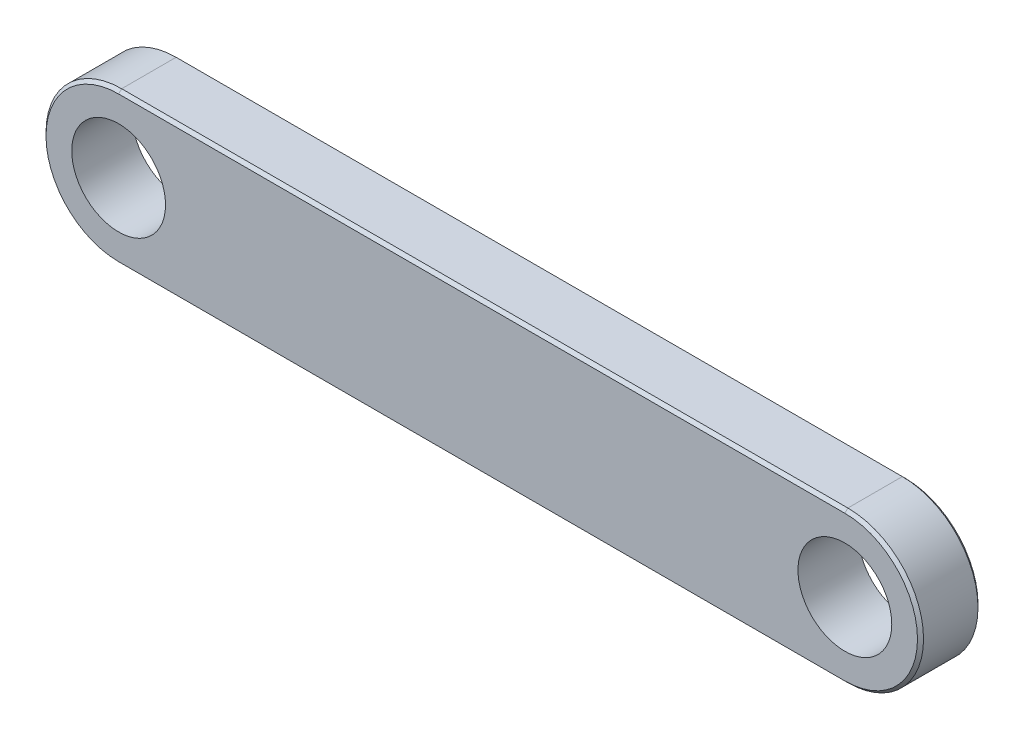
ISO-10303-21;
HEADER;
FILE_DESCRIPTION(('STEP AP214'),'2;1');
FILE_NAME('part.step','',(''),(''),'','','');
FILE_SCHEMA(('AUTOMOTIVE_DESIGN { 1 0 10303 214 1 1 1 1 }'));
ENDSEC;
DATA;
#1=APPLICATION_CONTEXT('core data for automotive mechanical design processes');
#2=APPLICATION_PROTOCOL_DEFINITION('international standard','automotive_design',2000,#1);
#3=PRODUCT_CONTEXT('',#1,'mechanical');
#4=PRODUCT('Part','Part','',(#3));
#5=PRODUCT_RELATED_PRODUCT_CATEGORY('part','',(#4));
#6=PRODUCT_DEFINITION_FORMATION('','',#4);
#7=PRODUCT_DEFINITION_CONTEXT('part definition',#1,'design');
#8=PRODUCT_DEFINITION('design','',#6,#7);
#9=PRODUCT_DEFINITION_SHAPE('','',#8);
#10=(LENGTH_UNIT() NAMED_UNIT(*) SI_UNIT(.MILLI.,.METRE.));
#11=(NAMED_UNIT(*) PLANE_ANGLE_UNIT() SI_UNIT($,.RADIAN.));
#12=(NAMED_UNIT(*) SI_UNIT($,.STERADIAN.) SOLID_ANGLE_UNIT());
#13=UNCERTAINTY_MEASURE_WITH_UNIT(LENGTH_MEASURE(1.E-05),#10,'distance_accuracy_value','');
#14=(GEOMETRIC_REPRESENTATION_CONTEXT(3) GLOBAL_UNCERTAINTY_ASSIGNED_CONTEXT((#13)) GLOBAL_UNIT_ASSIGNED_CONTEXT((#10,
#11,#12)) REPRESENTATION_CONTEXT('',''));
#15=CARTESIAN_POINT('',(0.,0.,0.));
#16=DIRECTION('',(0.,0.,1.));
#17=DIRECTION('',(1.,0.,0.));
#18=AXIS2_PLACEMENT_3D('',#15,#16,#17);
#19=CARTESIAN_POINT('',(-12.,0.,2.));
#20=DIRECTION('',(0.,0.,1.));
#21=DIRECTION('',(1.,0.,0.));
#22=AXIS2_PLACEMENT_3D('',#19,#20,#21);
#23=PLANE('',#22);
#24=DIRECTION('',(1.,0.,0.));
#25=VECTOR('',#24,1.);
#26=CARTESIAN_POINT('',(12.,-2.4,2.));
#27=LINE('',#26,#25);
#28=CARTESIAN_POINT('',(-12.,-2.4,2.));
#29=VERTEX_POINT('',#28);
#30=CARTESIAN_POINT('',(12.,-2.4,2.));
#31=VERTEX_POINT('',#30);
#32=EDGE_CURVE('E45',#29,#31,#27,.T.);
#33=ORIENTED_EDGE('',*,*,#32,.T.);
#34=CARTESIAN_POINT('',(12.,0.,2.));
#35=DIRECTION('',(0.,0.,1.));
#36=DIRECTION('',(1.,0.,0.));
#37=AXIS2_PLACEMENT_3D('',#34,#35,#36);
#38=CIRCLE('',#37,2.4);
#39=CARTESIAN_POINT('',(12.,2.4,2.));
#40=VERTEX_POINT('',#39);
#41=EDGE_CURVE('E11',#31,#40,#38,.T.);
#42=ORIENTED_EDGE('',*,*,#41,.T.);
#43=DIRECTION('',(-1.,0.,0.));
#44=VECTOR('',#43,1.);
#45=CARTESIAN_POINT('',(-12.,2.4,2.));
#46=LINE('',#45,#44);
#47=CARTESIAN_POINT('',(-12.,2.4,2.));
#48=VERTEX_POINT('',#47);
#49=EDGE_CURVE('E151',#40,#48,#46,.T.);
#50=ORIENTED_EDGE('',*,*,#49,.T.);
#51=CARTESIAN_POINT('',(-12.,0.,2.));
#52=DIRECTION('',(0.,0.,1.));
#53=DIRECTION('',(1.,0.,0.));
#54=AXIS2_PLACEMENT_3D('',#51,#52,#53);
#55=CIRCLE('',#54,2.4);
#56=EDGE_CURVE('E56',#48,#29,#55,.T.);
#57=ORIENTED_EDGE('',*,*,#56,.T.);
#58=EDGE_LOOP('',(#33,#42,#50,#57));
#59=FACE_BOUND('',#58,.T.);
#60=CARTESIAN_POINT('',(-12.,0.,2.));
#61=DIRECTION('',(0.,0.,1.));
#62=DIRECTION('',(1.,0.,0.));
#63=AXIS2_PLACEMENT_3D('',#60,#61,#62);
#64=CIRCLE('',#63,1.55);
#65=CARTESIAN_POINT('',(-10.45,0.,2.));
#66=VERTEX_POINT('',#65);
#67=EDGE_CURVE('E177',#66,#66,#64,.T.);
#68=ORIENTED_EDGE('',*,*,#67,.F.);
#69=EDGE_LOOP('',(#68));
#70=FACE_BOUND('',#69,.T.);
#71=CARTESIAN_POINT('',(12.,0.,2.));
#72=DIRECTION('',(0.,0.,1.));
#73=DIRECTION('',(1.,0.,0.));
#74=AXIS2_PLACEMENT_3D('',#71,#72,#73);
#75=CIRCLE('',#74,1.55);
#76=CARTESIAN_POINT('',(13.55,0.,2.));
#77=VERTEX_POINT('',#76);
#78=EDGE_CURVE('E181',#77,#77,#75,.T.);
#79=ORIENTED_EDGE('',*,*,#78,.F.);
#80=EDGE_LOOP('',(#79));
#81=FACE_BOUND('',#80,.T.);
#82=ADVANCED_FACE('F35',(#59,#70,#81),#23,.T.);
#83=CARTESIAN_POINT('',(-12.,0.,0.));
#84=DIRECTION('',(0.,0.,1.));
#85=DIRECTION('',(1.,0.,0.));
#86=AXIS2_PLACEMENT_3D('',#83,#84,#85);
#87=PLANE('',#86);
#88=DIRECTION('',(-1.,0.,0.));
#89=VECTOR('',#88,1.);
#90=CARTESIAN_POINT('',(-12.,-2.4,0.));
#91=LINE('',#90,#89);
#92=CARTESIAN_POINT('',(12.,-2.4,0.));
#93=VERTEX_POINT('',#92);
#94=CARTESIAN_POINT('',(-12.,-2.4,0.));
#95=VERTEX_POINT('',#94);
#96=EDGE_CURVE('E164',#93,#95,#91,.T.);
#97=ORIENTED_EDGE('',*,*,#96,.T.);
#98=CARTESIAN_POINT('',(-12.,0.,0.));
#99=DIRECTION('',(0.,0.,1.));
#100=DIRECTION('',(1.,0.,0.));
#101=AXIS2_PLACEMENT_3D('',#98,#99,#100);
#102=CIRCLE('',#101,2.4);
#103=CARTESIAN_POINT('',(-12.,2.4,0.));
#104=VERTEX_POINT('',#103);
#105=EDGE_CURVE('E112',#95,#104,#102,.F.);
#106=ORIENTED_EDGE('',*,*,#105,.T.);
#107=DIRECTION('',(1.,0.,0.));
#108=VECTOR('',#107,1.);
#109=CARTESIAN_POINT('',(-12.,2.4,0.));
#110=LINE('',#109,#108);
#111=CARTESIAN_POINT('',(12.,2.40000000000001,0.));
#112=VERTEX_POINT('',#111);
#113=EDGE_CURVE('E168',#104,#112,#110,.T.);
#114=ORIENTED_EDGE('',*,*,#113,.T.);
#115=CARTESIAN_POINT('',(12.,0.,0.));
#116=DIRECTION('',(0.,0.,1.));
#117=DIRECTION('',(1.,0.,0.));
#118=AXIS2_PLACEMENT_3D('',#115,#116,#117);
#119=CIRCLE('',#118,2.4);
#120=EDGE_CURVE('E166',#112,#93,#119,.F.);
#121=ORIENTED_EDGE('',*,*,#120,.T.);
#122=EDGE_LOOP('',(#97,#106,#114,#121));
#123=FACE_BOUND('',#122,.T.);
#124=CARTESIAN_POINT('',(-12.,0.,0.));
#125=DIRECTION('',(0.,0.,1.));
#126=DIRECTION('',(1.,0.,0.));
#127=AXIS2_PLACEMENT_3D('',#124,#125,#126);
#128=CIRCLE('',#127,1.55);
#129=CARTESIAN_POINT('',(-10.45,0.,0.));
#130=VERTEX_POINT('',#129);
#131=EDGE_CURVE('E178',#130,#130,#128,.T.);
#132=ORIENTED_EDGE('',*,*,#131,.T.);
#133=EDGE_LOOP('',(#132));
#134=FACE_BOUND('',#133,.T.);
#135=CARTESIAN_POINT('',(12.,0.,0.));
#136=DIRECTION('',(0.,0.,1.));
#137=DIRECTION('',(1.,0.,0.));
#138=AXIS2_PLACEMENT_3D('',#135,#136,#137);
#139=CIRCLE('',#138,1.55);
#140=CARTESIAN_POINT('',(13.55,0.,0.));
#141=VERTEX_POINT('',#140);
#142=EDGE_CURVE('E144',#141,#141,#139,.T.);
#143=ORIENTED_EDGE('',*,*,#142,.T.);
#144=EDGE_LOOP('',(#143));
#145=FACE_BOUND('',#144,.T.);
#146=ADVANCED_FACE('F193',(#123,#134,#145),#87,.F.);
#147=CARTESIAN_POINT('',(-12.,0.,2.));
#148=DIRECTION('',(0.,0.,-1.));
#149=DIRECTION('',(-1.,0.,0.));
#150=AXIS2_PLACEMENT_3D('',#147,#148,#149);
#151=CYLINDRICAL_SURFACE('',#150,2.5);
#152=DIRECTION('',(0.,0.,-1.));
#153=VECTOR('',#152,1.);
#154=CARTESIAN_POINT('',(-12.,2.5,2.));
#155=LINE('',#154,#153);
#156=CARTESIAN_POINT('',(-12.,2.5,1.9));
#157=VERTEX_POINT('',#156);
#158=CARTESIAN_POINT('',(-12.,2.5,0.0999999999999959));
#159=VERTEX_POINT('',#158);
#160=EDGE_CURVE('E175',#157,#159,#155,.T.);
#161=ORIENTED_EDGE('',*,*,#160,.T.);
#162=CARTESIAN_POINT('',(-12.,0.,0.0999999999999959));
#163=DIRECTION('',(0.,0.,1.));
#164=DIRECTION('',(1.,0.,0.));
#165=AXIS2_PLACEMENT_3D('',#162,#163,#164);
#166=CIRCLE('',#165,2.5);
#167=CARTESIAN_POINT('',(-12.,-2.5,0.0999999999999959));
#168=VERTEX_POINT('',#167);
#169=EDGE_CURVE('E122',#159,#168,#166,.T.);
#170=ORIENTED_EDGE('',*,*,#169,.T.);
#171=DIRECTION('',(0.,0.,-1.));
#172=VECTOR('',#171,1.);
#173=CARTESIAN_POINT('',(-12.,-2.5,2.));
#174=LINE('',#173,#172);
#175=CARTESIAN_POINT('',(-12.,-2.5,1.9));
#176=VERTEX_POINT('',#175);
#177=EDGE_CURVE('E105',#176,#168,#174,.T.);
#178=ORIENTED_EDGE('',*,*,#177,.F.);
#179=CARTESIAN_POINT('',(-12.,0.,1.9));
#180=DIRECTION('',(0.,0.,1.));
#181=DIRECTION('',(1.,0.,0.));
#182=AXIS2_PLACEMENT_3D('',#179,#180,#181);
#183=CIRCLE('',#182,2.5);
#184=EDGE_CURVE('E119',#176,#157,#183,.F.);
#185=ORIENTED_EDGE('',*,*,#184,.T.);
#186=EDGE_LOOP('',(#161,#170,#178,#185));
#187=FACE_BOUND('',#186,.T.);
#188=ADVANCED_FACE('F118',(#187),#151,.T.);
#189=CARTESIAN_POINT('',(-12.,-2.5,2.));
#190=DIRECTION('',(0.,1.,0.));
#191=DIRECTION('',(-1.,0.,0.));
#192=AXIS2_PLACEMENT_3D('',#189,#190,#191);
#193=PLANE('',#192);
#194=ORIENTED_EDGE('',*,*,#177,.T.);
#195=DIRECTION('',(1.,0.,0.));
#196=VECTOR('',#195,1.);
#197=CARTESIAN_POINT('',(-12.,-2.5,0.0999999999999959));
#198=LINE('',#197,#196);
#199=CARTESIAN_POINT('',(12.,-2.5,0.0999999999999959));
#200=VERTEX_POINT('',#199);
#201=EDGE_CURVE('E111',#168,#200,#198,.T.);
#202=ORIENTED_EDGE('',*,*,#201,.T.);
#203=DIRECTION('',(0.,0.,-1.));
#204=VECTOR('',#203,1.);
#205=CARTESIAN_POINT('',(12.,-2.5,2.));
#206=LINE('',#205,#204);
#207=CARTESIAN_POINT('',(12.,-2.5,1.9));
#208=VERTEX_POINT('',#207);
#209=EDGE_CURVE('E107',#208,#200,#206,.T.);
#210=ORIENTED_EDGE('',*,*,#209,.F.);
#211=DIRECTION('',(-1.,0.,0.));
#212=VECTOR('',#211,1.);
#213=CARTESIAN_POINT('',(-12.,-2.5,1.9));
#214=LINE('',#213,#212);
#215=EDGE_CURVE('E102',#208,#176,#214,.T.);
#216=ORIENTED_EDGE('',*,*,#215,.T.);
#217=EDGE_LOOP('',(#194,#202,#210,#216));
#218=FACE_BOUND('',#217,.T.);
#219=ADVANCED_FACE('F104',(#218),#193,.F.);
#220=CARTESIAN_POINT('',(12.,0.,2.));
#221=DIRECTION('',(0.,0.,-1.));
#222=DIRECTION('',(-1.,0.,0.));
#223=AXIS2_PLACEMENT_3D('',#220,#221,#222);
#224=CYLINDRICAL_SURFACE('',#223,2.5);
#225=ORIENTED_EDGE('',*,*,#209,.T.);
#226=CARTESIAN_POINT('',(12.,0.,0.0999999999999959));
#227=DIRECTION('',(0.,0.,1.));
#228=DIRECTION('',(1.,0.,0.));
#229=AXIS2_PLACEMENT_3D('',#226,#227,#228);
#230=CIRCLE('',#229,2.5);
#231=CARTESIAN_POINT('',(12.,2.5,0.0999999999999959));
#232=VERTEX_POINT('',#231);
#233=EDGE_CURVE('E157',#200,#232,#230,.T.);
#234=ORIENTED_EDGE('',*,*,#233,.T.);
#235=DIRECTION('',(0.,0.,-1.));
#236=VECTOR('',#235,1.);
#237=CARTESIAN_POINT('',(12.,2.5,2.));
#238=LINE('',#237,#236);
#239=CARTESIAN_POINT('',(12.,2.5,1.9));
#240=VERTEX_POINT('',#239);
#241=EDGE_CURVE('E172',#240,#232,#238,.T.);
#242=ORIENTED_EDGE('',*,*,#241,.F.);
#243=CARTESIAN_POINT('',(12.,0.,1.9));
#244=DIRECTION('',(0.,0.,1.));
#245=DIRECTION('',(1.,0.,0.));
#246=AXIS2_PLACEMENT_3D('',#243,#244,#245);
#247=CIRCLE('',#246,2.5);
#248=EDGE_CURVE('E159',#240,#208,#247,.F.);
#249=ORIENTED_EDGE('',*,*,#248,.T.);
#250=EDGE_LOOP('',(#225,#234,#242,#249));
#251=FACE_BOUND('',#250,.T.);
#252=ADVANCED_FACE('F208',(#251),#224,.T.);
#253=CARTESIAN_POINT('',(-12.,2.5,2.));
#254=DIRECTION('',(0.,-1.,0.));
#255=DIRECTION('',(1.,0.,0.));
#256=AXIS2_PLACEMENT_3D('',#253,#254,#255);
#257=PLANE('',#256);
#258=ORIENTED_EDGE('',*,*,#241,.T.);
#259=DIRECTION('',(-1.,0.,0.));
#260=VECTOR('',#259,1.);
#261=CARTESIAN_POINT('',(-12.,2.5,0.0999999999999959));
#262=LINE('',#261,#260);
#263=EDGE_CURVE('E153',#232,#159,#262,.T.);
#264=ORIENTED_EDGE('',*,*,#263,.T.);
#265=ORIENTED_EDGE('',*,*,#160,.F.);
#266=DIRECTION('',(1.,0.,0.));
#267=VECTOR('',#266,1.);
#268=CARTESIAN_POINT('',(12.,2.5,1.9));
#269=LINE('',#268,#267);
#270=EDGE_CURVE('E155',#157,#240,#269,.T.);
#271=ORIENTED_EDGE('',*,*,#270,.T.);
#272=EDGE_LOOP('',(#258,#264,#265,#271));
#273=FACE_BOUND('',#272,.T.);
#274=ADVANCED_FACE('F205',(#273),#257,.F.);
#275=CARTESIAN_POINT('',(-12.,0.,2.));
#276=DIRECTION('',(0.,0.,-1.));
#277=DIRECTION('',(-1.,0.,0.));
#278=AXIS2_PLACEMENT_3D('',#275,#276,#277);
#279=CYLINDRICAL_SURFACE('',#278,1.55);
#280=ORIENTED_EDGE('',*,*,#67,.T.);
#281=EDGE_LOOP('',(#280));
#282=FACE_BOUND('',#281,.T.);
#283=ORIENTED_EDGE('',*,*,#131,.F.);
#284=EDGE_LOOP('',(#283));
#285=FACE_BOUND('',#284,.T.);
#286=ADVANCED_FACE('F202',(#282,#285),#279,.F.);
#287=CARTESIAN_POINT('',(12.,0.,2.));
#288=DIRECTION('',(0.,0.,-1.));
#289=DIRECTION('',(-1.,0.,0.));
#290=AXIS2_PLACEMENT_3D('',#287,#288,#289);
#291=CYLINDRICAL_SURFACE('',#290,1.55);
#292=ORIENTED_EDGE('',*,*,#78,.T.);
#293=EDGE_LOOP('',(#292));
#294=FACE_BOUND('',#293,.T.);
#295=ORIENTED_EDGE('',*,*,#142,.F.);
#296=EDGE_LOOP('',(#295));
#297=FACE_BOUND('',#296,.T.);
#298=ADVANCED_FACE('F189',(#294,#297),#291,.F.);
#299=CARTESIAN_POINT('',(12.,0.,0.0999999999999959));
#300=DIRECTION('',(0.,0.,1.));
#301=DIRECTION('',(1.,0.,0.));
#302=AXIS2_PLACEMENT_3D('',#299,#300,#301);
#303=CONICAL_SURFACE('',#302,2.5,0.785398163397448);
#304=DIRECTION('',(0.,-0.707106781186548,0.707106781186548));
#305=VECTOR('',#304,1.);
#306=CARTESIAN_POINT('',(12.,-2.4,0.));
#307=LINE('',#306,#305);
#308=EDGE_CURVE('E145',#93,#200,#307,.T.);
#309=ORIENTED_EDGE('',*,*,#308,.F.);
#310=ORIENTED_EDGE('',*,*,#120,.F.);
#311=DIRECTION('',(0.,-0.707106781186548,-0.707106781186548));
#312=VECTOR('',#311,1.);
#313=CARTESIAN_POINT('',(12.,2.5,0.0999999999999959));
#314=LINE('',#313,#312);
#315=EDGE_CURVE('E141',#232,#112,#314,.T.);
#316=ORIENTED_EDGE('',*,*,#315,.F.);
#317=ORIENTED_EDGE('',*,*,#233,.F.);
#318=EDGE_LOOP('',(#309,#310,#316,#317));
#319=FACE_BOUND('',#318,.T.);
#320=ADVANCED_FACE('F238',(#319),#303,.T.);
#321=CARTESIAN_POINT('',(-12.,2.5,0.0999999999999959));
#322=DIRECTION('',(0.,-0.707106781186548,0.707106781186548));
#323=DIRECTION('',(-1.,0.,0.));
#324=AXIS2_PLACEMENT_3D('',#321,#322,#323);
#325=PLANE('',#324);
#326=ORIENTED_EDGE('',*,*,#315,.T.);
#327=ORIENTED_EDGE('',*,*,#113,.F.);
#328=DIRECTION('',(0.,-0.707106781186548,-0.707106781186548));
#329=VECTOR('',#328,1.);
#330=CARTESIAN_POINT('',(-12.,2.5,0.0999999999999959));
#331=LINE('',#330,#329);
#332=EDGE_CURVE('E132',#159,#104,#331,.T.);
#333=ORIENTED_EDGE('',*,*,#332,.F.);
#334=ORIENTED_EDGE('',*,*,#263,.F.);
#335=EDGE_LOOP('',(#326,#327,#333,#334));
#336=FACE_BOUND('',#335,.T.);
#337=ADVANCED_FACE('F231',(#336),#325,.F.);
#338=CARTESIAN_POINT('',(-12.,-2.5,0.0999999999999959));
#339=DIRECTION('',(0.,0.707106781186548,0.707106781186548));
#340=DIRECTION('',(1.,0.,0.));
#341=AXIS2_PLACEMENT_3D('',#338,#339,#340);
#342=PLANE('',#341);
#343=ORIENTED_EDGE('',*,*,#308,.T.);
#344=ORIENTED_EDGE('',*,*,#201,.F.);
#345=DIRECTION('',(0.,-0.707106781186548,0.707106781186548));
#346=VECTOR('',#345,1.);
#347=CARTESIAN_POINT('',(-12.,-2.4,0.));
#348=LINE('',#347,#346);
#349=EDGE_CURVE('E131',#95,#168,#348,.T.);
#350=ORIENTED_EDGE('',*,*,#349,.F.);
#351=ORIENTED_EDGE('',*,*,#96,.F.);
#352=EDGE_LOOP('',(#343,#344,#350,#351));
#353=FACE_BOUND('',#352,.T.);
#354=ADVANCED_FACE('F224',(#353),#342,.F.);
#355=CARTESIAN_POINT('',(-12.,0.,0.0999999999999959));
#356=DIRECTION('',(0.,0.,1.));
#357=DIRECTION('',(1.,0.,0.));
#358=AXIS2_PLACEMENT_3D('',#355,#356,#357);
#359=CONICAL_SURFACE('',#358,2.5,0.785398163397448);
#360=ORIENTED_EDGE('',*,*,#332,.T.);
#361=ORIENTED_EDGE('',*,*,#105,.F.);
#362=ORIENTED_EDGE('',*,*,#349,.T.);
#363=ORIENTED_EDGE('',*,*,#169,.F.);
#364=EDGE_LOOP('',(#360,#361,#362,#363));
#365=FACE_BOUND('',#364,.T.);
#366=ADVANCED_FACE('F218',(#365),#359,.T.);
#367=CARTESIAN_POINT('',(-12.,0.,2.));
#368=DIRECTION('',(0.,0.,-1.));
#369=DIRECTION('',(-1.,0.,0.));
#370=AXIS2_PLACEMENT_3D('',#367,#368,#369);
#371=CONICAL_SURFACE('',#370,2.4,0.785398163397448);
#372=DIRECTION('',(0.,-0.707106781186548,0.707106781186548));
#373=VECTOR('',#372,1.);
#374=CARTESIAN_POINT('',(-12.,2.5,1.9));
#375=LINE('',#374,#373);
#376=EDGE_CURVE('E127',#157,#48,#375,.T.);
#377=ORIENTED_EDGE('',*,*,#376,.F.);
#378=ORIENTED_EDGE('',*,*,#184,.F.);
#379=DIRECTION('',(0.,-0.707106781186548,-0.707106781186548));
#380=VECTOR('',#379,1.);
#381=CARTESIAN_POINT('',(-12.,-2.4,2.));
#382=LINE('',#381,#380);
#383=EDGE_CURVE('E40',#29,#176,#382,.T.);
#384=ORIENTED_EDGE('',*,*,#383,.F.);
#385=ORIENTED_EDGE('',*,*,#56,.F.);
#386=EDGE_LOOP('',(#377,#378,#384,#385));
#387=FACE_BOUND('',#386,.T.);
#388=ADVANCED_FACE('F38',(#387),#371,.T.);
#389=CARTESIAN_POINT('',(-12.,-2.4,2.));
#390=DIRECTION('',(0.,-0.707106781186548,0.707106781186548));
#391=DIRECTION('',(-1.,0.,0.));
#392=AXIS2_PLACEMENT_3D('',#389,#390,#391);
#393=PLANE('',#392);
#394=ORIENTED_EDGE('',*,*,#383,.T.);
#395=ORIENTED_EDGE('',*,*,#215,.F.);
#396=DIRECTION('',(0.,-0.707106781186548,-0.707106781186548));
#397=VECTOR('',#396,1.);
#398=CARTESIAN_POINT('',(12.,-2.4,2.));
#399=LINE('',#398,#397);
#400=EDGE_CURVE('E134',#31,#208,#399,.T.);
#401=ORIENTED_EDGE('',*,*,#400,.F.);
#402=ORIENTED_EDGE('',*,*,#32,.F.);
#403=EDGE_LOOP('',(#394,#395,#401,#402));
#404=FACE_BOUND('',#403,.T.);
#405=ADVANCED_FACE('F130',(#404),#393,.T.);
#406=CARTESIAN_POINT('',(-12.,2.4,2.));
#407=DIRECTION('',(0.,0.707106781186548,0.707106781186548));
#408=DIRECTION('',(1.,0.,0.));
#409=AXIS2_PLACEMENT_3D('',#406,#407,#408);
#410=PLANE('',#409);
#411=ORIENTED_EDGE('',*,*,#376,.T.);
#412=ORIENTED_EDGE('',*,*,#49,.F.);
#413=DIRECTION('',(0.,-0.707106781186548,0.707106781186548));
#414=VECTOR('',#413,1.);
#415=CARTESIAN_POINT('',(12.,2.5,1.9));
#416=LINE('',#415,#414);
#417=EDGE_CURVE('E137',#240,#40,#416,.T.);
#418=ORIENTED_EDGE('',*,*,#417,.F.);
#419=ORIENTED_EDGE('',*,*,#270,.F.);
#420=EDGE_LOOP('',(#411,#412,#418,#419));
#421=FACE_BOUND('',#420,.T.);
#422=ADVANCED_FACE('F252',(#421),#410,.T.);
#423=CARTESIAN_POINT('',(12.,0.,2.));
#424=DIRECTION('',(0.,0.,-1.));
#425=DIRECTION('',(-1.,0.,0.));
#426=AXIS2_PLACEMENT_3D('',#423,#424,#425);
#427=CONICAL_SURFACE('',#426,2.4,0.785398163397448);
#428=ORIENTED_EDGE('',*,*,#400,.T.);
#429=ORIENTED_EDGE('',*,*,#248,.F.);
#430=ORIENTED_EDGE('',*,*,#417,.T.);
#431=ORIENTED_EDGE('',*,*,#41,.F.);
#432=EDGE_LOOP('',(#428,#429,#430,#431));
#433=FACE_BOUND('',#432,.T.);
#434=ADVANCED_FACE('F246',(#433),#427,.T.);
#435=CLOSED_SHELL('',(#82,#146,#188,#219,#252,#274,#286,#298,#320,#337,#354,#366,#388,#405,#422,#434));
#436=MANIFOLD_SOLID_BREP('B2',#435);
#437=ADVANCED_BREP_SHAPE_REPRESENTATION('',(#18,#436),#14);
#438=SHAPE_DEFINITION_REPRESENTATION(#9,#437);
ENDSEC;
END-ISO-10303-21;
